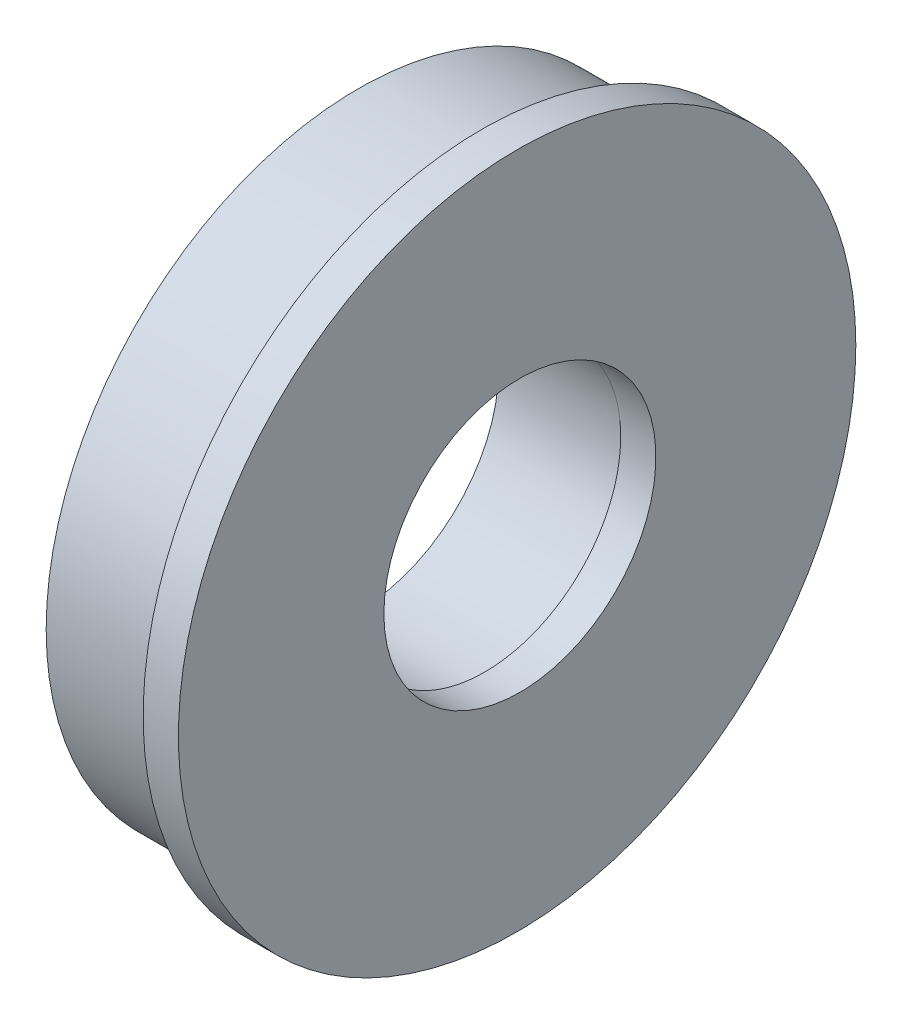
ISO-10303-21;
HEADER;
FILE_DESCRIPTION(('STEP AP214'),'2;1');
FILE_NAME('part.step','',(''),(''),'','','');
FILE_SCHEMA(('AUTOMOTIVE_DESIGN { 1 0 10303 214 1 1 1 1 }'));
ENDSEC;
DATA;
#1=APPLICATION_CONTEXT('core data for automotive mechanical design processes');
#2=APPLICATION_PROTOCOL_DEFINITION('international standard','automotive_design',2000,#1);
#3=PRODUCT_CONTEXT('',#1,'mechanical');
#4=PRODUCT('Part','Part','',(#3));
#5=PRODUCT_RELATED_PRODUCT_CATEGORY('part','',(#4));
#6=PRODUCT_DEFINITION_FORMATION('','',#4);
#7=PRODUCT_DEFINITION_CONTEXT('part definition',#1,'design');
#8=PRODUCT_DEFINITION('design','',#6,#7);
#9=PRODUCT_DEFINITION_SHAPE('','',#8);
#10=(LENGTH_UNIT() NAMED_UNIT(*) SI_UNIT(.MILLI.,.METRE.));
#11=(NAMED_UNIT(*) PLANE_ANGLE_UNIT() SI_UNIT($,.RADIAN.));
#12=(NAMED_UNIT(*) SI_UNIT($,.STERADIAN.) SOLID_ANGLE_UNIT());
#13=UNCERTAINTY_MEASURE_WITH_UNIT(LENGTH_MEASURE(1.E-05),#10,'distance_accuracy_value','');
#14=(GEOMETRIC_REPRESENTATION_CONTEXT(3) GLOBAL_UNCERTAINTY_ASSIGNED_CONTEXT((#13)) GLOBAL_UNIT_ASSIGNED_CONTEXT((#10,
#11,#12)) REPRESENTATION_CONTEXT('',''));
#15=CARTESIAN_POINT('',(0.,0.,0.));
#16=DIRECTION('',(0.,0.,1.));
#17=DIRECTION('',(1.,0.,0.));
#18=AXIS2_PLACEMENT_3D('',#15,#16,#17);
#19=CARTESIAN_POINT('',(0.,282.690366741438,373.314059341408));
#20=DIRECTION('',(1.,0.,0.));
#21=DIRECTION('',(0.,0.,-1.));
#22=AXIS2_PLACEMENT_3D('',#19,#20,#21);
#23=PLANE('',#22);
#24=CARTESIAN_POINT('',(0.,282.690366741438,373.314059341408));
#25=DIRECTION('',(1.,0.,0.));
#26=DIRECTION('',(0.,0.,-1.));
#27=AXIS2_PLACEMENT_3D('',#24,#25,#26);
#28=CIRCLE('',#27,35.4210207057906);
#29=CARTESIAN_POINT('',(0.,282.690366741438,337.893038635617));
#30=VERTEX_POINT('',#29);
#31=EDGE_CURVE('E43',#30,#30,#28,.T.);
#32=ORIENTED_EDGE('',*,*,#31,.F.);
#33=EDGE_LOOP('',(#32));
#34=FACE_BOUND('',#33,.T.);
#35=CARTESIAN_POINT('',(0.,282.690366741438,373.314059341408));
#36=DIRECTION('',(1.,0.,0.));
#37=DIRECTION('',(0.,0.,-1.));
#38=AXIS2_PLACEMENT_3D('',#35,#36,#37);
#39=CIRCLE('',#38,15.9151750028934);
#40=CARTESIAN_POINT('',(0.,282.690366741438,357.398884338514));
#41=VERTEX_POINT('',#40);
#42=EDGE_CURVE('E74',#41,#41,#39,.T.);
#43=ORIENTED_EDGE('',*,*,#42,.T.);
#44=EDGE_LOOP('',(#43));
#45=FACE_BOUND('',#44,.T.);
#46=ADVANCED_FACE('F39',(#34,#45),#23,.F.);
#47=CARTESIAN_POINT('',(14.,282.690366741438,373.314059341408));
#48=DIRECTION('',(-1.,0.,0.));
#49=DIRECTION('',(0.,0.,1.));
#50=AXIS2_PLACEMENT_3D('',#47,#48,#49);
#51=CYLINDRICAL_SURFACE('',#50,35.4210207057906);
#52=CARTESIAN_POINT('',(14.,282.690366741438,373.314059341408));
#53=DIRECTION('',(1.,0.,0.));
#54=DIRECTION('',(0.,0.,-1.));
#55=AXIS2_PLACEMENT_3D('',#52,#53,#54);
#56=CIRCLE('',#55,35.4210207057906);
#57=CARTESIAN_POINT('',(14.,282.690366741438,337.893038635617));
#58=VERTEX_POINT('',#57);
#59=EDGE_CURVE('E11',#58,#58,#56,.T.);
#60=ORIENTED_EDGE('',*,*,#59,.F.);
#61=EDGE_LOOP('',(#60));
#62=FACE_BOUND('',#61,.T.);
#63=ORIENTED_EDGE('',*,*,#31,.T.);
#64=EDGE_LOOP('',(#63));
#65=FACE_BOUND('',#64,.T.);
#66=ADVANCED_FACE('F41',(#62,#65),#51,.T.);
#67=CARTESIAN_POINT('',(14.,282.690366741438,373.314059341408));
#68=DIRECTION('',(-1.,0.,0.));
#69=DIRECTION('',(0.,0.,1.));
#70=AXIS2_PLACEMENT_3D('',#67,#68,#69);
#71=CYLINDRICAL_SURFACE('',#70,15.9151750028934);
#72=CARTESIAN_POINT('',(14.,282.690366741438,373.314059341408));
#73=DIRECTION('',(1.,0.,0.));
#74=DIRECTION('',(0.,0.,-1.));
#75=AXIS2_PLACEMENT_3D('',#72,#73,#74);
#76=CIRCLE('',#75,15.9151750028934);
#77=CARTESIAN_POINT('',(14.,294.835350729228,363.028527789318));
#78=VERTEX_POINT('',#77);
#79=EDGE_CURVE('E68',#78,#78,#76,.T.);
#80=ORIENTED_EDGE('',*,*,#79,.T.);
#81=EDGE_LOOP('',(#80));
#82=FACE_BOUND('',#81,.T.);
#83=ORIENTED_EDGE('',*,*,#42,.F.);
#84=EDGE_LOOP('',(#83));
#85=FACE_BOUND('',#84,.T.);
#86=ADVANCED_FACE('F88',(#82,#85),#71,.F.);
#87=CARTESIAN_POINT('',(14.,282.690366741438,373.314059341408));
#88=DIRECTION('',(1.,0.,0.));
#89=DIRECTION('',(0.,0.,-1.));
#90=AXIS2_PLACEMENT_3D('',#87,#88,#89);
#91=PLANE('',#90);
#92=ORIENTED_EDGE('',*,*,#79,.F.);
#93=CARTESIAN_POINT('',(14.,283.061430008877,372.999807552446));
#94=DIRECTION('',(-1.,0.,0.));
#95=DIRECTION('',(0.,0.,1.));
#96=AXIS2_PLACEMENT_3D('',#93,#94,#95);
#97=CIRCLE('',#96,15.4289218432045);
#98=EDGE_CURVE('E51',#78,#78,#97,.T.);
#99=ORIENTED_EDGE('',*,*,#98,.F.);
#100=EDGE_LOOP('',(#92,#99));
#101=FACE_BOUND('',#100,.T.);
#102=ADVANCED_FACE('F93',(#101),#91,.F.);
#103=CARTESIAN_POINT('',(18.,282.690366741438,373.314059341408));
#104=DIRECTION('',(-1.,0.,0.));
#105=DIRECTION('',(0.,0.,1.));
#106=AXIS2_PLACEMENT_3D('',#103,#104,#105);
#107=CYLINDRICAL_SURFACE('',#106,38.4210207057906);
#108=CARTESIAN_POINT('',(18.,282.690366741438,373.314059341408));
#109=DIRECTION('',(1.,0.,0.));
#110=DIRECTION('',(0.,0.,-1.));
#111=AXIS2_PLACEMENT_3D('',#108,#109,#110);
#112=CIRCLE('',#111,38.4210207057906);
#113=CARTESIAN_POINT('',(18.,282.690366741438,334.893038635617));
#114=VERTEX_POINT('',#113);
#115=EDGE_CURVE('E64',#114,#114,#112,.T.);
#116=ORIENTED_EDGE('',*,*,#115,.F.);
#117=EDGE_LOOP('',(#116));
#118=FACE_BOUND('',#117,.T.);
#119=CARTESIAN_POINT('',(14.,282.690366741438,373.314059341408));
#120=DIRECTION('',(1.,0.,0.));
#121=DIRECTION('',(0.,0.,-1.));
#122=AXIS2_PLACEMENT_3D('',#119,#120,#121);
#123=CIRCLE('',#122,38.4210207057906);
#124=CARTESIAN_POINT('',(14.,282.690366741438,334.893038635617));
#125=VERTEX_POINT('',#124);
#126=EDGE_CURVE('E61',#125,#125,#123,.T.);
#127=ORIENTED_EDGE('',*,*,#126,.T.);
#128=EDGE_LOOP('',(#127));
#129=FACE_BOUND('',#128,.T.);
#130=ADVANCED_FACE('F95',(#118,#129),#107,.T.);
#131=CARTESIAN_POINT('',(18.,282.690366741438,373.314059341408));
#132=DIRECTION('',(1.,0.,0.));
#133=DIRECTION('',(0.,0.,-1.));
#134=AXIS2_PLACEMENT_3D('',#131,#132,#133);
#135=PLANE('',#134);
#136=CARTESIAN_POINT('',(18.,283.061430008877,372.999807552446));
#137=DIRECTION('',(-1.,0.,0.));
#138=DIRECTION('',(0.,0.,1.));
#139=AXIS2_PLACEMENT_3D('',#136,#137,#138);
#140=CIRCLE('',#139,15.4289218432045);
#141=CARTESIAN_POINT('',(18.,283.061430008877,388.428729395651));
#142=VERTEX_POINT('',#141);
#143=EDGE_CURVE('E57',#142,#142,#140,.T.);
#144=ORIENTED_EDGE('',*,*,#143,.T.);
#145=EDGE_LOOP('',(#144));
#146=FACE_BOUND('',#145,.T.);
#147=ORIENTED_EDGE('',*,*,#115,.T.);
#148=EDGE_LOOP('',(#147));
#149=FACE_BOUND('',#148,.T.);
#150=ADVANCED_FACE('F98',(#146,#149),#135,.T.);
#151=ORIENTED_EDGE('',*,*,#59,.T.);
#152=EDGE_LOOP('',(#151));
#153=FACE_BOUND('',#152,.T.);
#154=ORIENTED_EDGE('',*,*,#126,.F.);
#155=EDGE_LOOP('',(#154));
#156=FACE_BOUND('',#155,.T.);
#157=ADVANCED_FACE('F100',(#153,#156),#91,.F.);
#158=CARTESIAN_POINT('',(18.,283.061430008877,372.999807552446));
#159=DIRECTION('',(-1.,0.,0.));
#160=DIRECTION('',(0.,0.,1.));
#161=AXIS2_PLACEMENT_3D('',#158,#159,#160);
#162=CYLINDRICAL_SURFACE('',#161,15.4289218432045);
#163=ORIENTED_EDGE('',*,*,#143,.F.);
#164=EDGE_LOOP('',(#163));
#165=FACE_BOUND('',#164,.T.);
#166=ORIENTED_EDGE('',*,*,#98,.T.);
#167=EDGE_LOOP('',(#166));
#168=FACE_BOUND('',#167,.T.);
#169=ADVANCED_FACE('F52',(#165,#168),#162,.F.);
#170=CLOSED_SHELL('',(#46,#66,#86,#102,#130,#150,#157,#169));
#171=MANIFOLD_SOLID_BREP('B2',#170);
#172=ADVANCED_BREP_SHAPE_REPRESENTATION('',(#18,#171),#14);
#173=SHAPE_DEFINITION_REPRESENTATION(#9,#172);
ENDSEC;
END-ISO-10303-21;
